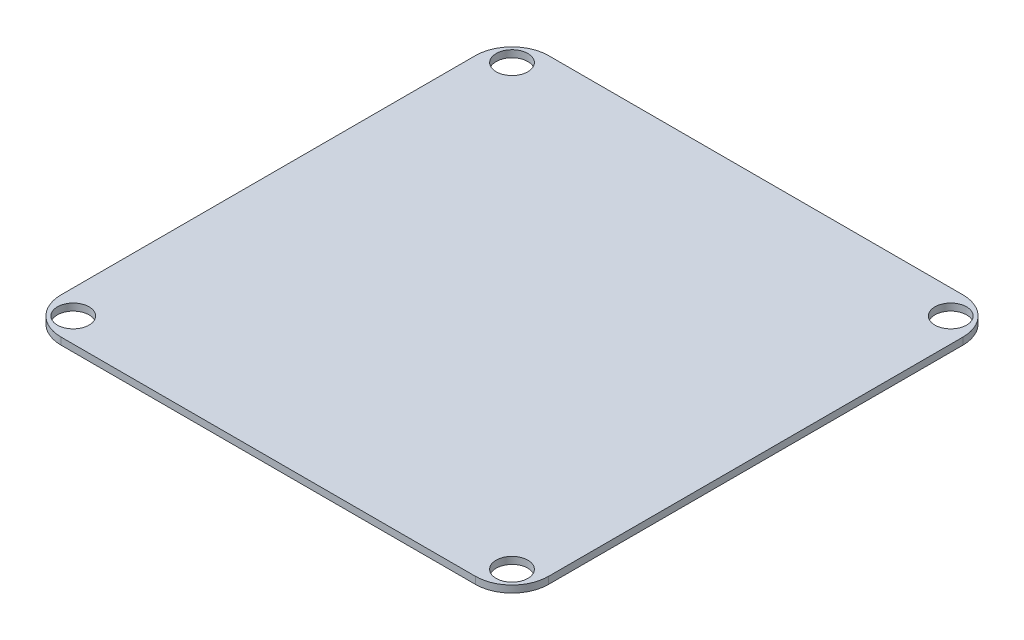
ISO-10303-21;
HEADER;
FILE_DESCRIPTION(('STEP AP214'),'2;1');
FILE_NAME('part.step','',(''),(''),'','','');
FILE_SCHEMA(('AUTOMOTIVE_DESIGN { 1 0 10303 214 1 1 1 1 }'));
ENDSEC;
DATA;
#1=APPLICATION_CONTEXT('core data for automotive mechanical design processes');
#2=APPLICATION_PROTOCOL_DEFINITION('international standard','automotive_design',2000,#1);
#3=PRODUCT_CONTEXT('',#1,'mechanical');
#4=PRODUCT('Part','Part','',(#3));
#5=PRODUCT_RELATED_PRODUCT_CATEGORY('part','',(#4));
#6=PRODUCT_DEFINITION_FORMATION('','',#4);
#7=PRODUCT_DEFINITION_CONTEXT('part definition',#1,'design');
#8=PRODUCT_DEFINITION('design','',#6,#7);
#9=PRODUCT_DEFINITION_SHAPE('','',#8);
#10=(LENGTH_UNIT() NAMED_UNIT(*) SI_UNIT(.MILLI.,.METRE.));
#11=(NAMED_UNIT(*) PLANE_ANGLE_UNIT() SI_UNIT($,.RADIAN.));
#12=(NAMED_UNIT(*) SI_UNIT($,.STERADIAN.) SOLID_ANGLE_UNIT());
#13=UNCERTAINTY_MEASURE_WITH_UNIT(LENGTH_MEASURE(1.E-05),#10,'distance_accuracy_value','');
#14=(GEOMETRIC_REPRESENTATION_CONTEXT(3) GLOBAL_UNCERTAINTY_ASSIGNED_CONTEXT((#13)) GLOBAL_UNIT_ASSIGNED_CONTEXT((#10,
#11,#12)) REPRESENTATION_CONTEXT('',''));
#15=CARTESIAN_POINT('',(0.,0.,0.));
#16=DIRECTION('',(0.,0.,1.));
#17=DIRECTION('',(1.,0.,0.));
#18=AXIS2_PLACEMENT_3D('',#15,#16,#17);
#19=CARTESIAN_POINT('',(-21.59,0.73152,21.59));
#20=DIRECTION('',(0.,-1.,0.));
#21=DIRECTION('',(0.,0.,-1.));
#22=AXIS2_PLACEMENT_3D('',#19,#20,#21);
#23=PLANE('',#22);
#24=CARTESIAN_POINT('',(-21.59,0.73152,21.59));
#25=DIRECTION('',(0.,1.,0.));
#26=DIRECTION('',(0.,0.,-1.));
#27=AXIS2_PLACEMENT_3D('',#24,#25,#26);
#28=CIRCLE('',#27,3.81);
#29=CARTESIAN_POINT('',(-25.4,0.73152,21.59));
#30=VERTEX_POINT('',#29);
#31=CARTESIAN_POINT('',(-21.59,0.73152,25.4));
#32=VERTEX_POINT('',#31);
#33=EDGE_CURVE('E145',#30,#32,#28,.T.);
#34=ORIENTED_EDGE('',*,*,#33,.T.);
#35=DIRECTION('',(1.,0.,0.));
#36=VECTOR('',#35,1.);
#37=CARTESIAN_POINT('',(-21.59,0.73152,25.4));
#38=LINE('',#37,#36);
#39=CARTESIAN_POINT('',(21.59,0.73152,25.4));
#40=VERTEX_POINT('',#39);
#41=EDGE_CURVE('E93',#32,#40,#38,.T.);
#42=ORIENTED_EDGE('',*,*,#41,.T.);
#43=CARTESIAN_POINT('',(21.59,0.73152,21.59));
#44=DIRECTION('',(0.,1.,0.));
#45=DIRECTION('',(0.,0.,-1.));
#46=AXIS2_PLACEMENT_3D('',#43,#44,#45);
#47=CIRCLE('',#46,3.81);
#48=CARTESIAN_POINT('',(25.4,0.73152,21.59));
#49=VERTEX_POINT('',#48);
#50=EDGE_CURVE('E160',#40,#49,#47,.T.);
#51=ORIENTED_EDGE('',*,*,#50,.T.);
#52=DIRECTION('',(0.,0.,-1.));
#53=VECTOR('',#52,1.);
#54=CARTESIAN_POINT('',(25.4,0.73152,-21.59));
#55=LINE('',#54,#53);
#56=CARTESIAN_POINT('',(25.4,0.73152,-21.59));
#57=VERTEX_POINT('',#56);
#58=EDGE_CURVE('E173',#49,#57,#55,.T.);
#59=ORIENTED_EDGE('',*,*,#58,.T.);
#60=CARTESIAN_POINT('',(21.59,0.73152,-21.59));
#61=DIRECTION('',(0.,1.,0.));
#62=DIRECTION('',(0.,0.,1.));
#63=AXIS2_PLACEMENT_3D('',#60,#61,#62);
#64=CIRCLE('',#63,3.81);
#65=CARTESIAN_POINT('',(21.59,0.73152,-25.4));
#66=VERTEX_POINT('',#65);
#67=EDGE_CURVE('E112',#57,#66,#64,.T.);
#68=ORIENTED_EDGE('',*,*,#67,.T.);
#69=DIRECTION('',(-1.,0.,0.));
#70=VECTOR('',#69,1.);
#71=CARTESIAN_POINT('',(-21.59,0.73152,-25.4));
#72=LINE('',#71,#70);
#73=CARTESIAN_POINT('',(-21.59,0.73152,-25.4));
#74=VERTEX_POINT('',#73);
#75=EDGE_CURVE('E106',#66,#74,#72,.T.);
#76=ORIENTED_EDGE('',*,*,#75,.T.);
#77=CARTESIAN_POINT('',(-21.59,0.73152,-21.59));
#78=DIRECTION('',(0.,1.,0.));
#79=DIRECTION('',(0.,0.,1.));
#80=AXIS2_PLACEMENT_3D('',#77,#78,#79);
#81=CIRCLE('',#80,3.81);
#82=CARTESIAN_POINT('',(-25.4,0.73152,-21.59));
#83=VERTEX_POINT('',#82);
#84=EDGE_CURVE('E110',#74,#83,#81,.T.);
#85=ORIENTED_EDGE('',*,*,#84,.T.);
#86=DIRECTION('',(0.,0.,1.));
#87=VECTOR('',#86,1.);
#88=CARTESIAN_POINT('',(-25.4,0.73152,-21.59));
#89=LINE('',#88,#87);
#90=EDGE_CURVE('E50',#83,#30,#89,.T.);
#91=ORIENTED_EDGE('',*,*,#90,.T.);
#92=EDGE_LOOP('',(#34,#42,#51,#59,#68,#76,#85,#91));
#93=FACE_BOUND('',#92,.T.);
#94=CARTESIAN_POINT('',(-22.86,0.73152,-22.86));
#95=DIRECTION('',(0.,1.,0.));
#96=DIRECTION('',(0.,0.,1.));
#97=AXIS2_PLACEMENT_3D('',#94,#95,#96);
#98=CIRCLE('',#97,1.651);
#99=CARTESIAN_POINT('',(-22.86,0.73152,-21.209));
#100=VERTEX_POINT('',#99);
#101=EDGE_CURVE('E134',#100,#100,#98,.T.);
#102=ORIENTED_EDGE('',*,*,#101,.F.);
#103=EDGE_LOOP('',(#102));
#104=FACE_BOUND('',#103,.T.);
#105=CARTESIAN_POINT('',(22.86,0.73152,-22.86));
#106=DIRECTION('',(0.,1.,0.));
#107=DIRECTION('',(0.,0.,1.));
#108=AXIS2_PLACEMENT_3D('',#105,#106,#107);
#109=CIRCLE('',#108,1.651);
#110=CARTESIAN_POINT('',(22.86,0.73152,-21.209));
#111=VERTEX_POINT('',#110);
#112=EDGE_CURVE('E182',#111,#111,#109,.T.);
#113=ORIENTED_EDGE('',*,*,#112,.F.);
#114=EDGE_LOOP('',(#113));
#115=FACE_BOUND('',#114,.T.);
#116=CARTESIAN_POINT('',(22.86,0.73152,22.86));
#117=DIRECTION('',(0.,1.,0.));
#118=DIRECTION('',(0.,0.,1.));
#119=AXIS2_PLACEMENT_3D('',#116,#117,#118);
#120=CIRCLE('',#119,1.651);
#121=CARTESIAN_POINT('',(22.86,0.73152,24.511));
#122=VERTEX_POINT('',#121);
#123=EDGE_CURVE('E188',#122,#122,#120,.T.);
#124=ORIENTED_EDGE('',*,*,#123,.F.);
#125=EDGE_LOOP('',(#124));
#126=FACE_BOUND('',#125,.T.);
#127=CARTESIAN_POINT('',(-22.86,0.73152,22.86));
#128=DIRECTION('',(0.,1.,0.));
#129=DIRECTION('',(0.,0.,1.));
#130=AXIS2_PLACEMENT_3D('',#127,#128,#129);
#131=CIRCLE('',#130,1.651);
#132=CARTESIAN_POINT('',(-22.86,0.73152,24.511));
#133=VERTEX_POINT('',#132);
#134=EDGE_CURVE('E194',#133,#133,#131,.T.);
#135=ORIENTED_EDGE('',*,*,#134,.F.);
#136=EDGE_LOOP('',(#135));
#137=FACE_BOUND('',#136,.T.);
#138=ADVANCED_FACE('F33',(#93,#104,#115,#126,#137),#23,.F.);
#139=CARTESIAN_POINT('',(-21.59,0.,21.59));
#140=DIRECTION('',(0.,-1.,0.));
#141=DIRECTION('',(0.,0.,-1.));
#142=AXIS2_PLACEMENT_3D('',#139,#140,#141);
#143=PLANE('',#142);
#144=CARTESIAN_POINT('',(22.86,0.,22.86));
#145=DIRECTION('',(0.,1.,0.));
#146=DIRECTION('',(0.,0.,1.));
#147=AXIS2_PLACEMENT_3D('',#144,#145,#146);
#148=CIRCLE('',#147,1.651);
#149=CARTESIAN_POINT('',(22.86,0.,24.511));
#150=VERTEX_POINT('',#149);
#151=EDGE_CURVE('E191',#150,#150,#148,.T.);
#152=ORIENTED_EDGE('',*,*,#151,.T.);
#153=EDGE_LOOP('',(#152));
#154=FACE_BOUND('',#153,.T.);
#155=CARTESIAN_POINT('',(-22.86,0.,-22.86));
#156=DIRECTION('',(0.,1.,0.));
#157=DIRECTION('',(0.,0.,1.));
#158=AXIS2_PLACEMENT_3D('',#155,#156,#157);
#159=CIRCLE('',#158,1.651);
#160=CARTESIAN_POINT('',(-22.86,0.,-21.209));
#161=VERTEX_POINT('',#160);
#162=EDGE_CURVE('E179',#161,#161,#159,.T.);
#163=ORIENTED_EDGE('',*,*,#162,.T.);
#164=EDGE_LOOP('',(#163));
#165=FACE_BOUND('',#164,.T.);
#166=CARTESIAN_POINT('',(-21.59,0.,21.59));
#167=DIRECTION('',(0.,1.,0.));
#168=DIRECTION('',(0.,0.,-1.));
#169=AXIS2_PLACEMENT_3D('',#166,#167,#168);
#170=CIRCLE('',#169,3.81);
#171=CARTESIAN_POINT('',(-25.4,0.,21.59));
#172=VERTEX_POINT('',#171);
#173=CARTESIAN_POINT('',(-21.59,0.,25.4));
#174=VERTEX_POINT('',#173);
#175=EDGE_CURVE('E130',#172,#174,#170,.T.);
#176=ORIENTED_EDGE('',*,*,#175,.F.);
#177=DIRECTION('',(0.,0.,1.));
#178=VECTOR('',#177,1.);
#179=CARTESIAN_POINT('',(-25.4,0.,-21.59));
#180=LINE('',#179,#178);
#181=CARTESIAN_POINT('',(-25.4,0.,-21.59));
#182=VERTEX_POINT('',#181);
#183=EDGE_CURVE('E85',#182,#172,#180,.T.);
#184=ORIENTED_EDGE('',*,*,#183,.F.);
#185=CARTESIAN_POINT('',(-21.59,0.,-21.59));
#186=DIRECTION('',(0.,1.,0.));
#187=DIRECTION('',(0.,0.,1.));
#188=AXIS2_PLACEMENT_3D('',#185,#186,#187);
#189=CIRCLE('',#188,3.81);
#190=CARTESIAN_POINT('',(-21.59,0.,-25.4));
#191=VERTEX_POINT('',#190);
#192=EDGE_CURVE('E79',#191,#182,#189,.T.);
#193=ORIENTED_EDGE('',*,*,#192,.F.);
#194=DIRECTION('',(-1.,0.,0.));
#195=VECTOR('',#194,1.);
#196=CARTESIAN_POINT('',(-21.59,0.,-25.4));
#197=LINE('',#196,#195);
#198=CARTESIAN_POINT('',(21.59,0.,-25.4));
#199=VERTEX_POINT('',#198);
#200=EDGE_CURVE('E120',#199,#191,#197,.T.);
#201=ORIENTED_EDGE('',*,*,#200,.F.);
#202=CARTESIAN_POINT('',(21.59,0.,-21.59));
#203=DIRECTION('',(0.,1.,0.));
#204=DIRECTION('',(0.,0.,1.));
#205=AXIS2_PLACEMENT_3D('',#202,#203,#204);
#206=CIRCLE('',#205,3.81);
#207=CARTESIAN_POINT('',(25.4,0.,-21.59));
#208=VERTEX_POINT('',#207);
#209=EDGE_CURVE('E140',#208,#199,#206,.T.);
#210=ORIENTED_EDGE('',*,*,#209,.F.);
#211=DIRECTION('',(0.,0.,-1.));
#212=VECTOR('',#211,1.);
#213=CARTESIAN_POINT('',(25.4,0.,-21.59));
#214=LINE('',#213,#212);
#215=CARTESIAN_POINT('',(25.4,0.,21.59));
#216=VERTEX_POINT('',#215);
#217=EDGE_CURVE('E138',#216,#208,#214,.T.);
#218=ORIENTED_EDGE('',*,*,#217,.F.);
#219=CARTESIAN_POINT('',(21.59,0.,21.59));
#220=DIRECTION('',(0.,1.,0.));
#221=DIRECTION('',(0.,0.,-1.));
#222=AXIS2_PLACEMENT_3D('',#219,#220,#221);
#223=CIRCLE('',#222,3.81);
#224=CARTESIAN_POINT('',(21.59,0.,25.4));
#225=VERTEX_POINT('',#224);
#226=EDGE_CURVE('E136',#225,#216,#223,.T.);
#227=ORIENTED_EDGE('',*,*,#226,.F.);
#228=DIRECTION('',(1.,0.,0.));
#229=VECTOR('',#228,1.);
#230=CARTESIAN_POINT('',(-21.59,0.,25.4));
#231=LINE('',#230,#229);
#232=EDGE_CURVE('E133',#174,#225,#231,.T.);
#233=ORIENTED_EDGE('',*,*,#232,.F.);
#234=EDGE_LOOP('',(#176,#184,#193,#201,#210,#218,#227,#233));
#235=FACE_BOUND('',#234,.T.);
#236=CARTESIAN_POINT('',(22.86,0.,-22.86));
#237=DIRECTION('',(0.,1.,0.));
#238=DIRECTION('',(0.,0.,1.));
#239=AXIS2_PLACEMENT_3D('',#236,#237,#238);
#240=CIRCLE('',#239,1.651);
#241=CARTESIAN_POINT('',(22.86,0.,-21.209));
#242=VERTEX_POINT('',#241);
#243=EDGE_CURVE('E185',#242,#242,#240,.T.);
#244=ORIENTED_EDGE('',*,*,#243,.T.);
#245=EDGE_LOOP('',(#244));
#246=FACE_BOUND('',#245,.T.);
#247=CARTESIAN_POINT('',(-22.86,0.,22.86));
#248=DIRECTION('',(0.,1.,0.));
#249=DIRECTION('',(0.,0.,1.));
#250=AXIS2_PLACEMENT_3D('',#247,#248,#249);
#251=CIRCLE('',#250,1.651);
#252=CARTESIAN_POINT('',(-22.86,0.,24.511));
#253=VERTEX_POINT('',#252);
#254=EDGE_CURVE('E197',#253,#253,#251,.T.);
#255=ORIENTED_EDGE('',*,*,#254,.T.);
#256=EDGE_LOOP('',(#255));
#257=FACE_BOUND('',#256,.T.);
#258=ADVANCED_FACE('F164',(#154,#165,#235,#246,#257),#143,.T.);
#259=CARTESIAN_POINT('',(-21.59,0.73152,21.59));
#260=DIRECTION('',(0.,-1.,0.));
#261=DIRECTION('',(0.,0.,-1.));
#262=AXIS2_PLACEMENT_3D('',#259,#260,#261);
#263=CYLINDRICAL_SURFACE('',#262,3.81);
#264=ORIENTED_EDGE('',*,*,#175,.T.);
#265=DIRECTION('',(0.,-1.,0.));
#266=VECTOR('',#265,1.);
#267=CARTESIAN_POINT('',(-21.59,0.73152,25.4));
#268=LINE('',#267,#266);
#269=EDGE_CURVE('E11',#32,#174,#268,.T.);
#270=ORIENTED_EDGE('',*,*,#269,.F.);
#271=ORIENTED_EDGE('',*,*,#33,.F.);
#272=DIRECTION('',(0.,-1.,0.));
#273=VECTOR('',#272,1.);
#274=CARTESIAN_POINT('',(-25.4,0.73152,21.59));
#275=LINE('',#274,#273);
#276=EDGE_CURVE('E126',#30,#172,#275,.T.);
#277=ORIENTED_EDGE('',*,*,#276,.T.);
#278=EDGE_LOOP('',(#264,#270,#271,#277));
#279=FACE_BOUND('',#278,.T.);
#280=ADVANCED_FACE('F35',(#279),#263,.T.);
#281=CARTESIAN_POINT('',(-21.59,0.73152,25.4));
#282=DIRECTION('',(0.,0.,-1.));
#283=DIRECTION('',(-1.,0.,0.));
#284=AXIS2_PLACEMENT_3D('',#281,#282,#283);
#285=PLANE('',#284);
#286=ORIENTED_EDGE('',*,*,#232,.T.);
#287=DIRECTION('',(0.,-1.,0.));
#288=VECTOR('',#287,1.);
#289=CARTESIAN_POINT('',(21.59,0.73152,25.4));
#290=LINE('',#289,#288);
#291=EDGE_CURVE('E42',#40,#225,#290,.T.);
#292=ORIENTED_EDGE('',*,*,#291,.F.);
#293=ORIENTED_EDGE('',*,*,#41,.F.);
#294=ORIENTED_EDGE('',*,*,#269,.T.);
#295=EDGE_LOOP('',(#286,#292,#293,#294));
#296=FACE_BOUND('',#295,.T.);
#297=ADVANCED_FACE('F229',(#296),#285,.F.);
#298=CARTESIAN_POINT('',(21.59,0.73152,21.59));
#299=DIRECTION('',(0.,-1.,0.));
#300=DIRECTION('',(0.,0.,-1.));
#301=AXIS2_PLACEMENT_3D('',#298,#299,#300);
#302=CYLINDRICAL_SURFACE('',#301,3.81);
#303=ORIENTED_EDGE('',*,*,#226,.T.);
#304=DIRECTION('',(0.,-1.,0.));
#305=VECTOR('',#304,1.);
#306=CARTESIAN_POINT('',(25.4,0.73152,21.59));
#307=LINE('',#306,#305);
#308=EDGE_CURVE('E152',#49,#216,#307,.T.);
#309=ORIENTED_EDGE('',*,*,#308,.F.);
#310=ORIENTED_EDGE('',*,*,#50,.F.);
#311=ORIENTED_EDGE('',*,*,#291,.T.);
#312=EDGE_LOOP('',(#303,#309,#310,#311));
#313=FACE_BOUND('',#312,.T.);
#314=ADVANCED_FACE('F158',(#313),#302,.T.);
#315=CARTESIAN_POINT('',(25.4,0.73152,-21.59));
#316=DIRECTION('',(-1.,0.,0.));
#317=DIRECTION('',(0.,0.,1.));
#318=AXIS2_PLACEMENT_3D('',#315,#316,#317);
#319=PLANE('',#318);
#320=ORIENTED_EDGE('',*,*,#217,.T.);
#321=DIRECTION('',(0.,-1.,0.));
#322=VECTOR('',#321,1.);
#323=CARTESIAN_POINT('',(25.4,0.73152,-21.59));
#324=LINE('',#323,#322);
#325=EDGE_CURVE('E149',#57,#208,#324,.T.);
#326=ORIENTED_EDGE('',*,*,#325,.F.);
#327=ORIENTED_EDGE('',*,*,#58,.F.);
#328=ORIENTED_EDGE('',*,*,#308,.T.);
#329=EDGE_LOOP('',(#320,#326,#327,#328));
#330=FACE_BOUND('',#329,.T.);
#331=ADVANCED_FACE('F169',(#330),#319,.F.);
#332=CARTESIAN_POINT('',(21.59,0.73152,-21.59));
#333=DIRECTION('',(0.,-1.,0.));
#334=DIRECTION('',(0.,0.,-1.));
#335=AXIS2_PLACEMENT_3D('',#332,#333,#334);
#336=CYLINDRICAL_SURFACE('',#335,3.81);
#337=ORIENTED_EDGE('',*,*,#209,.T.);
#338=DIRECTION('',(0.,-1.,0.));
#339=VECTOR('',#338,1.);
#340=CARTESIAN_POINT('',(21.59,0.73152,-25.4));
#341=LINE('',#340,#339);
#342=EDGE_CURVE('E121',#66,#199,#341,.T.);
#343=ORIENTED_EDGE('',*,*,#342,.F.);
#344=ORIENTED_EDGE('',*,*,#67,.F.);
#345=ORIENTED_EDGE('',*,*,#325,.T.);
#346=EDGE_LOOP('',(#337,#343,#344,#345));
#347=FACE_BOUND('',#346,.T.);
#348=ADVANCED_FACE('F172',(#347),#336,.T.);
#349=CARTESIAN_POINT('',(-21.59,0.73152,-25.4));
#350=DIRECTION('',(0.,0.,1.));
#351=DIRECTION('',(1.,0.,0.));
#352=AXIS2_PLACEMENT_3D('',#349,#350,#351);
#353=PLANE('',#352);
#354=ORIENTED_EDGE('',*,*,#200,.T.);
#355=DIRECTION('',(0.,-1.,0.));
#356=VECTOR('',#355,1.);
#357=CARTESIAN_POINT('',(-21.59,0.73152,-25.4));
#358=LINE('',#357,#356);
#359=EDGE_CURVE('E117',#74,#191,#358,.T.);
#360=ORIENTED_EDGE('',*,*,#359,.F.);
#361=ORIENTED_EDGE('',*,*,#75,.F.);
#362=ORIENTED_EDGE('',*,*,#342,.T.);
#363=EDGE_LOOP('',(#354,#360,#361,#362));
#364=FACE_BOUND('',#363,.T.);
#365=ADVANCED_FACE('F118',(#364),#353,.F.);
#366=CARTESIAN_POINT('',(-21.59,0.73152,-21.59));
#367=DIRECTION('',(0.,-1.,0.));
#368=DIRECTION('',(0.,0.,-1.));
#369=AXIS2_PLACEMENT_3D('',#366,#367,#368);
#370=CYLINDRICAL_SURFACE('',#369,3.81);
#371=ORIENTED_EDGE('',*,*,#192,.T.);
#372=DIRECTION('',(0.,-1.,0.));
#373=VECTOR('',#372,1.);
#374=CARTESIAN_POINT('',(-25.4,0.73152,-21.59));
#375=LINE('',#374,#373);
#376=EDGE_CURVE('E122',#83,#182,#375,.T.);
#377=ORIENTED_EDGE('',*,*,#376,.F.);
#378=ORIENTED_EDGE('',*,*,#84,.F.);
#379=ORIENTED_EDGE('',*,*,#359,.T.);
#380=EDGE_LOOP('',(#371,#377,#378,#379));
#381=FACE_BOUND('',#380,.T.);
#382=ADVANCED_FACE('F124',(#381),#370,.T.);
#383=CARTESIAN_POINT('',(-25.4,0.73152,-21.59));
#384=DIRECTION('',(1.,0.,0.));
#385=DIRECTION('',(0.,0.,-1.));
#386=AXIS2_PLACEMENT_3D('',#383,#384,#385);
#387=PLANE('',#386);
#388=ORIENTED_EDGE('',*,*,#183,.T.);
#389=ORIENTED_EDGE('',*,*,#276,.F.);
#390=ORIENTED_EDGE('',*,*,#90,.F.);
#391=ORIENTED_EDGE('',*,*,#376,.T.);
#392=EDGE_LOOP('',(#388,#389,#390,#391));
#393=FACE_BOUND('',#392,.T.);
#394=ADVANCED_FACE('F217',(#393),#387,.F.);
#395=CARTESIAN_POINT('',(-22.86,0.73152,-22.86));
#396=DIRECTION('',(0.,-1.,0.));
#397=DIRECTION('',(0.,0.,-1.));
#398=AXIS2_PLACEMENT_3D('',#395,#396,#397);
#399=CYLINDRICAL_SURFACE('',#398,1.651);
#400=ORIENTED_EDGE('',*,*,#101,.T.);
#401=EDGE_LOOP('',(#400));
#402=FACE_BOUND('',#401,.T.);
#403=ORIENTED_EDGE('',*,*,#162,.F.);
#404=EDGE_LOOP('',(#403));
#405=FACE_BOUND('',#404,.T.);
#406=ADVANCED_FACE('F214',(#402,#405),#399,.F.);
#407=CARTESIAN_POINT('',(22.86,0.73152,-22.86));
#408=DIRECTION('',(0.,-1.,0.));
#409=DIRECTION('',(0.,0.,-1.));
#410=AXIS2_PLACEMENT_3D('',#407,#408,#409);
#411=CYLINDRICAL_SURFACE('',#410,1.651);
#412=ORIENTED_EDGE('',*,*,#112,.T.);
#413=EDGE_LOOP('',(#412));
#414=FACE_BOUND('',#413,.T.);
#415=ORIENTED_EDGE('',*,*,#243,.F.);
#416=EDGE_LOOP('',(#415));
#417=FACE_BOUND('',#416,.T.);
#418=ADVANCED_FACE('F293',(#414,#417),#411,.F.);
#419=CARTESIAN_POINT('',(22.86,0.73152,22.86));
#420=DIRECTION('',(0.,-1.,0.));
#421=DIRECTION('',(0.,0.,-1.));
#422=AXIS2_PLACEMENT_3D('',#419,#420,#421);
#423=CYLINDRICAL_SURFACE('',#422,1.651);
#424=ORIENTED_EDGE('',*,*,#123,.T.);
#425=EDGE_LOOP('',(#424));
#426=FACE_BOUND('',#425,.T.);
#427=ORIENTED_EDGE('',*,*,#151,.F.);
#428=EDGE_LOOP('',(#427));
#429=FACE_BOUND('',#428,.T.);
#430=ADVANCED_FACE('F301',(#426,#429),#423,.F.);
#431=CARTESIAN_POINT('',(-22.86,0.73152,22.86));
#432=DIRECTION('',(0.,-1.,0.));
#433=DIRECTION('',(0.,0.,-1.));
#434=AXIS2_PLACEMENT_3D('',#431,#432,#433);
#435=CYLINDRICAL_SURFACE('',#434,1.651);
#436=ORIENTED_EDGE('',*,*,#134,.T.);
#437=EDGE_LOOP('',(#436));
#438=FACE_BOUND('',#437,.T.);
#439=ORIENTED_EDGE('',*,*,#254,.F.);
#440=EDGE_LOOP('',(#439));
#441=FACE_BOUND('',#440,.T.);
#442=ADVANCED_FACE('F203',(#438,#441),#435,.F.);
#443=CLOSED_SHELL('',(#138,#258,#280,#297,#314,#331,#348,#365,#382,#394,#406,#418,#430,#442));
#444=MANIFOLD_SOLID_BREP('B2',#443);
#445=ADVANCED_BREP_SHAPE_REPRESENTATION('',(#18,#444),#14);
#446=SHAPE_DEFINITION_REPRESENTATION(#9,#445);
ENDSEC;
END-ISO-10303-21;
